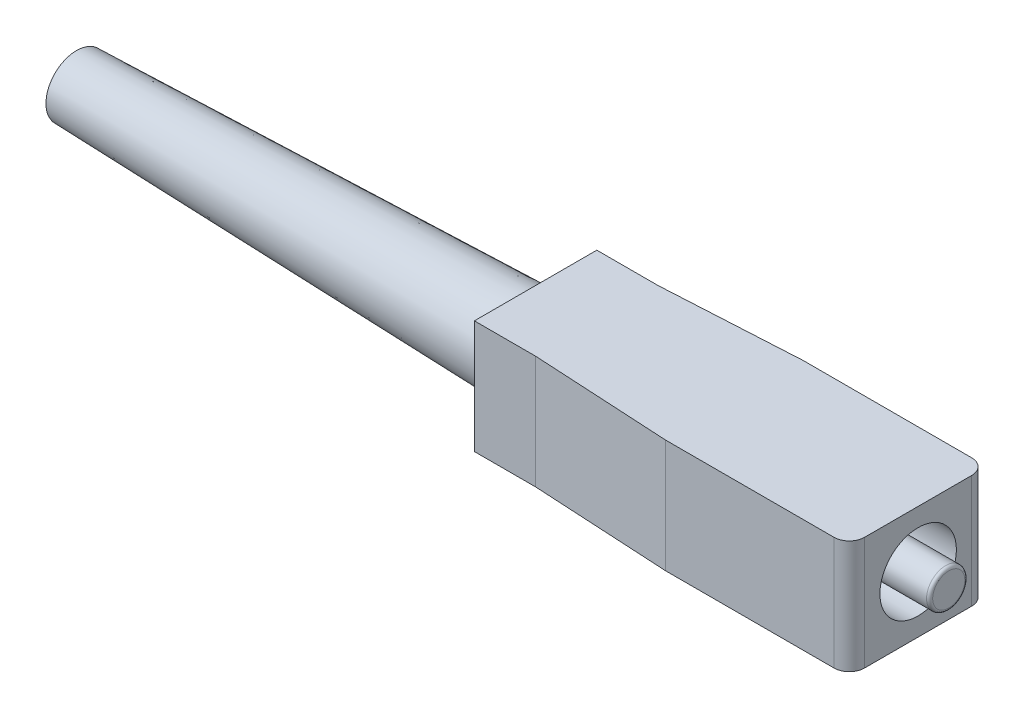
ISO-10303-21;
HEADER;
FILE_DESCRIPTION(('STEP AP214'),'2;1');
FILE_NAME('part.step','',(''),(''),'','','');
FILE_SCHEMA(('AUTOMOTIVE_DESIGN { 1 0 10303 214 1 1 1 1 }'));
ENDSEC;
DATA;
#1=APPLICATION_CONTEXT('core data for automotive mechanical design processes');
#2=APPLICATION_PROTOCOL_DEFINITION('international standard','automotive_design',2000,#1);
#3=PRODUCT_CONTEXT('',#1,'mechanical');
#4=PRODUCT('Part','Part','',(#3));
#5=PRODUCT_RELATED_PRODUCT_CATEGORY('part','',(#4));
#6=PRODUCT_DEFINITION_FORMATION('','',#4);
#7=PRODUCT_DEFINITION_CONTEXT('part definition',#1,'design');
#8=PRODUCT_DEFINITION('design','',#6,#7);
#9=PRODUCT_DEFINITION_SHAPE('','',#8);
#10=(LENGTH_UNIT() NAMED_UNIT(*) SI_UNIT(.MILLI.,.METRE.));
#11=(NAMED_UNIT(*) PLANE_ANGLE_UNIT() SI_UNIT($,.RADIAN.));
#12=(NAMED_UNIT(*) SI_UNIT($,.STERADIAN.) SOLID_ANGLE_UNIT());
#13=UNCERTAINTY_MEASURE_WITH_UNIT(LENGTH_MEASURE(1.E-05),#10,'distance_accuracy_value','');
#14=(GEOMETRIC_REPRESENTATION_CONTEXT(3) GLOBAL_UNCERTAINTY_ASSIGNED_CONTEXT((#13)) GLOBAL_UNIT_ASSIGNED_CONTEXT((#10,
#11,#12)) REPRESENTATION_CONTEXT('',''));
#15=CARTESIAN_POINT('',(0.,0.,0.));
#16=DIRECTION('',(0.,0.,1.));
#17=DIRECTION('',(1.,0.,0.));
#18=AXIS2_PLACEMENT_3D('',#15,#16,#17);
#19=CARTESIAN_POINT('',(7.,0.,0.));
#20=DIRECTION('',(1.,0.,0.));
#21=DIRECTION('',(0.,0.,-1.));
#22=AXIS2_PLACEMENT_3D('',#19,#20,#21);
#23=PLANE('',#22);
#24=CARTESIAN_POINT('',(7.,0.,0.));
#25=DIRECTION('',(1.,0.,0.));
#26=DIRECTION('',(0.,0.,-1.));
#27=AXIS2_PLACEMENT_3D('',#24,#25,#26);
#28=CIRCLE('',#27,2.5);
#29=CARTESIAN_POINT('',(7.,0.,-2.5));
#30=VERTEX_POINT('',#29);
#31=EDGE_CURVE('E145',#30,#30,#28,.T.);
#32=ORIENTED_EDGE('',*,*,#31,.T.);
#33=EDGE_LOOP('',(#32));
#34=FACE_BOUND('',#33,.T.);
#35=CARTESIAN_POINT('',(7.,0.,0.));
#36=DIRECTION('',(1.,0.,0.));
#37=DIRECTION('',(0.,0.,-1.));
#38=AXIS2_PLACEMENT_3D('',#35,#36,#37);
#39=CIRCLE('',#38,1.25);
#40=CARTESIAN_POINT('',(7.,0.,1.25));
#41=VERTEX_POINT('',#40);
#42=EDGE_CURVE('E412',#41,#41,#39,.T.);
#43=ORIENTED_EDGE('',*,*,#42,.F.);
#44=EDGE_LOOP('',(#43));
#45=FACE_BOUND('',#44,.T.);
#46=ADVANCED_FACE('F39',(#34,#45),#23,.T.);
#47=CARTESIAN_POINT('',(-9.,-3.7,-4.));
#48=DIRECTION('',(0.,0.,-1.));
#49=DIRECTION('',(-1.,0.,0.));
#50=AXIS2_PLACEMENT_3D('',#47,#48,#49);
#51=PLANE('',#50);
#52=DIRECTION('',(0.,1.,0.));
#53=VECTOR('',#52,1.);
#54=CARTESIAN_POINT('',(-13.,-3.7,-4.));
#55=LINE('',#54,#53);
#56=CARTESIAN_POINT('',(-13.,-3.7,-4.));
#57=VERTEX_POINT('',#56);
#58=CARTESIAN_POINT('',(-13.,3.7,-4.));
#59=VERTEX_POINT('',#58);
#60=EDGE_CURVE('E119',#57,#59,#55,.T.);
#61=ORIENTED_EDGE('',*,*,#60,.T.);
#62=DIRECTION('',(-1.,0.,0.));
#63=VECTOR('',#62,1.);
#64=CARTESIAN_POINT('',(-9.,3.7,-4.));
#65=LINE('',#64,#63);
#66=CARTESIAN_POINT('',(-9.,3.7,-4.));
#67=VERTEX_POINT('',#66);
#68=EDGE_CURVE('E123',#67,#59,#65,.T.);
#69=ORIENTED_EDGE('',*,*,#68,.F.);
#70=DIRECTION('',(0.,1.,0.));
#71=VECTOR('',#70,1.);
#72=CARTESIAN_POINT('',(-9.,-3.7,-4.));
#73=LINE('',#72,#71);
#74=CARTESIAN_POINT('',(-9.,-3.7,-4.));
#75=VERTEX_POINT('',#74);
#76=EDGE_CURVE('E182',#75,#67,#73,.T.);
#77=ORIENTED_EDGE('',*,*,#76,.F.);
#78=DIRECTION('',(-1.,0.,0.));
#79=VECTOR('',#78,1.);
#80=CARTESIAN_POINT('',(-9.,-3.7,-4.));
#81=LINE('',#80,#79);
#82=EDGE_CURVE('E125',#75,#57,#81,.T.);
#83=ORIENTED_EDGE('',*,*,#82,.T.);
#84=EDGE_LOOP('',(#61,#69,#77,#83));
#85=FACE_BOUND('',#84,.T.);
#86=ADVANCED_FACE('F121',(#85),#51,.T.);
#87=CARTESIAN_POINT('',(0.,-3.7,-4.5));
#88=DIRECTION('',(-0.055470019622523,0.,-0.998460353205412));
#89=DIRECTION('',(-0.998460353205412,0.,0.0554700196225231));
#90=AXIS2_PLACEMENT_3D('',#87,#88,#89);
#91=PLANE('',#90);
#92=ORIENTED_EDGE('',*,*,#76,.T.);
#93=DIRECTION('',(-0.998460353205412,0.,0.0554700196225231));
#94=VECTOR('',#93,1.);
#95=CARTESIAN_POINT('',(0.,3.7,-4.5));
#96=LINE('',#95,#94);
#97=CARTESIAN_POINT('',(0.,3.7,-4.5));
#98=VERTEX_POINT('',#97);
#99=EDGE_CURVE('E144',#98,#67,#96,.T.);
#100=ORIENTED_EDGE('',*,*,#99,.F.);
#101=DIRECTION('',(0.,1.,0.));
#102=VECTOR('',#101,1.);
#103=CARTESIAN_POINT('',(0.,-3.7,-4.5));
#104=LINE('',#103,#102);
#105=CARTESIAN_POINT('',(0.,-3.7,-4.5));
#106=VERTEX_POINT('',#105);
#107=EDGE_CURVE('E185',#106,#98,#104,.T.);
#108=ORIENTED_EDGE('',*,*,#107,.F.);
#109=DIRECTION('',(-0.998460353205412,0.,0.0554700196225231));
#110=VECTOR('',#109,1.);
#111=CARTESIAN_POINT('',(0.,-3.7,-4.5));
#112=LINE('',#111,#110);
#113=EDGE_CURVE('E130',#106,#75,#112,.T.);
#114=ORIENTED_EDGE('',*,*,#113,.T.);
#115=EDGE_LOOP('',(#92,#100,#108,#114));
#116=FACE_BOUND('',#115,.T.);
#117=ADVANCED_FACE('F243',(#116),#91,.T.);
#118=CARTESIAN_POINT('',(12.,-3.7,-4.5));
#119=DIRECTION('',(0.,0.,-1.));
#120=DIRECTION('',(-1.,0.,0.));
#121=AXIS2_PLACEMENT_3D('',#118,#119,#120);
#122=PLANE('',#121);
#123=DIRECTION('',(-1.,0.,0.));
#124=VECTOR('',#123,1.);
#125=CARTESIAN_POINT('',(12.,3.7,-4.5));
#126=LINE('',#125,#124);
#127=CARTESIAN_POINT('',(11.,3.7,-4.5));
#128=VERTEX_POINT('',#127);
#129=EDGE_CURVE('E161',#128,#98,#126,.T.);
#130=ORIENTED_EDGE('',*,*,#129,.F.);
#131=DIRECTION('',(0.,1.,0.));
#132=VECTOR('',#131,1.);
#133=CARTESIAN_POINT('',(11.,-3.7,-4.5));
#134=LINE('',#133,#132);
#135=CARTESIAN_POINT('',(11.,-3.7,-4.5));
#136=VERTEX_POINT('',#135);
#137=EDGE_CURVE('E62',#128,#136,#134,.F.);
#138=ORIENTED_EDGE('',*,*,#137,.T.);
#139=DIRECTION('',(-1.,0.,0.));
#140=VECTOR('',#139,1.);
#141=CARTESIAN_POINT('',(12.,-3.7,-4.5));
#142=LINE('',#141,#140);
#143=EDGE_CURVE('E178',#136,#106,#142,.T.);
#144=ORIENTED_EDGE('',*,*,#143,.T.);
#145=ORIENTED_EDGE('',*,*,#107,.T.);
#146=EDGE_LOOP('',(#130,#138,#144,#145));
#147=FACE_BOUND('',#146,.T.);
#148=ADVANCED_FACE('F256',(#147),#122,.T.);
#149=CARTESIAN_POINT('',(12.,-3.7,-4.5));
#150=DIRECTION('',(1.,0.,0.));
#151=DIRECTION('',(0.,0.,-1.));
#152=AXIS2_PLACEMENT_3D('',#149,#150,#151);
#153=PLANE('',#152);
#154=CARTESIAN_POINT('',(12.,0.,0.));
#155=DIRECTION('',(1.,0.,0.));
#156=DIRECTION('',(0.,0.,-1.));
#157=AXIS2_PLACEMENT_3D('',#154,#155,#156);
#158=CIRCLE('',#157,2.5);
#159=CARTESIAN_POINT('',(12.,0.,-2.5));
#160=VERTEX_POINT('',#159);
#161=EDGE_CURVE('E148',#160,#160,#158,.T.);
#162=ORIENTED_EDGE('',*,*,#161,.F.);
#163=EDGE_LOOP('',(#162));
#164=FACE_BOUND('',#163,.T.);
#165=DIRECTION('',(0.,0.,-1.));
#166=VECTOR('',#165,1.);
#167=CARTESIAN_POINT('',(12.,-3.7,-4.5));
#168=LINE('',#167,#166);
#169=CARTESIAN_POINT('',(12.,-3.7,3.5));
#170=VERTEX_POINT('',#169);
#171=CARTESIAN_POINT('',(12.,-3.7,-3.5));
#172=VERTEX_POINT('',#171);
#173=EDGE_CURVE('E175',#170,#172,#168,.T.);
#174=ORIENTED_EDGE('',*,*,#173,.T.);
#175=DIRECTION('',(0.,1.,0.));
#176=VECTOR('',#175,1.);
#177=CARTESIAN_POINT('',(12.,-3.7,-3.5));
#178=LINE('',#177,#176);
#179=CARTESIAN_POINT('',(12.,3.7,-3.5));
#180=VERTEX_POINT('',#179);
#181=EDGE_CURVE('E194',#172,#180,#178,.T.);
#182=ORIENTED_EDGE('',*,*,#181,.T.);
#183=DIRECTION('',(0.,0.,-1.));
#184=VECTOR('',#183,1.);
#185=CARTESIAN_POINT('',(12.,3.7,-4.5));
#186=LINE('',#185,#184);
#187=CARTESIAN_POINT('',(12.,3.7,3.5));
#188=VERTEX_POINT('',#187);
#189=EDGE_CURVE('E159',#188,#180,#186,.T.);
#190=ORIENTED_EDGE('',*,*,#189,.F.);
#191=DIRECTION('',(0.,1.,0.));
#192=VECTOR('',#191,1.);
#193=CARTESIAN_POINT('',(12.,-3.7,3.5));
#194=LINE('',#193,#192);
#195=EDGE_CURVE('E184',#188,#170,#194,.F.);
#196=ORIENTED_EDGE('',*,*,#195,.T.);
#197=EDGE_LOOP('',(#174,#182,#190,#196));
#198=FACE_BOUND('',#197,.T.);
#199=ADVANCED_FACE('F260',(#164,#198),#153,.T.);
#200=CARTESIAN_POINT('',(12.,-3.7,4.5));
#201=DIRECTION('',(0.,0.,1.));
#202=DIRECTION('',(1.,0.,0.));
#203=AXIS2_PLACEMENT_3D('',#200,#201,#202);
#204=PLANE('',#203);
#205=DIRECTION('',(1.,0.,0.));
#206=VECTOR('',#205,1.);
#207=CARTESIAN_POINT('',(12.,-3.7,4.5));
#208=LINE('',#207,#206);
#209=CARTESIAN_POINT('',(0.,-3.7,4.5));
#210=VERTEX_POINT('',#209);
#211=CARTESIAN_POINT('',(11.,-3.7,4.5));
#212=VERTEX_POINT('',#211);
#213=EDGE_CURVE('E173',#210,#212,#208,.T.);
#214=ORIENTED_EDGE('',*,*,#213,.T.);
#215=DIRECTION('',(0.,1.,0.));
#216=VECTOR('',#215,1.);
#217=CARTESIAN_POINT('',(11.,-3.7,4.5));
#218=LINE('',#217,#216);
#219=CARTESIAN_POINT('',(11.,3.7,4.5));
#220=VERTEX_POINT('',#219);
#221=EDGE_CURVE('E205',#212,#220,#218,.T.);
#222=ORIENTED_EDGE('',*,*,#221,.T.);
#223=DIRECTION('',(1.,0.,0.));
#224=VECTOR('',#223,1.);
#225=CARTESIAN_POINT('',(12.,3.7,4.5));
#226=LINE('',#225,#224);
#227=CARTESIAN_POINT('',(0.,3.7,4.5));
#228=VERTEX_POINT('',#227);
#229=EDGE_CURVE('E156',#228,#220,#226,.T.);
#230=ORIENTED_EDGE('',*,*,#229,.F.);
#231=DIRECTION('',(0.,1.,0.));
#232=VECTOR('',#231,1.);
#233=CARTESIAN_POINT('',(0.,-3.7,4.5));
#234=LINE('',#233,#232);
#235=EDGE_CURVE('E188',#210,#228,#234,.T.);
#236=ORIENTED_EDGE('',*,*,#235,.F.);
#237=EDGE_LOOP('',(#214,#222,#230,#236));
#238=FACE_BOUND('',#237,.T.);
#239=ADVANCED_FACE('F263',(#238),#204,.T.);
#240=CARTESIAN_POINT('',(0.,-3.7,4.5));
#241=DIRECTION('',(-0.055470019622523,0.,0.998460353205412));
#242=DIRECTION('',(0.998460353205412,0.,0.0554700196225231));
#243=AXIS2_PLACEMENT_3D('',#240,#241,#242);
#244=PLANE('',#243);
#245=ORIENTED_EDGE('',*,*,#235,.T.);
#246=DIRECTION('',(0.998460353205412,0.,0.0554700196225231));
#247=VECTOR('',#246,1.);
#248=CARTESIAN_POINT('',(0.,3.7,4.5));
#249=LINE('',#248,#247);
#250=CARTESIAN_POINT('',(-9.,3.7,4.));
#251=VERTEX_POINT('',#250);
#252=EDGE_CURVE('E153',#251,#228,#249,.T.);
#253=ORIENTED_EDGE('',*,*,#252,.F.);
#254=DIRECTION('',(0.,1.,0.));
#255=VECTOR('',#254,1.);
#256=CARTESIAN_POINT('',(-9.,-3.7,4.));
#257=LINE('',#256,#255);
#258=CARTESIAN_POINT('',(-9.,-3.7,4.));
#259=VERTEX_POINT('',#258);
#260=EDGE_CURVE('E190',#259,#251,#257,.T.);
#261=ORIENTED_EDGE('',*,*,#260,.F.);
#262=DIRECTION('',(0.998460353205412,0.,0.0554700196225231));
#263=VECTOR('',#262,1.);
#264=CARTESIAN_POINT('',(0.,-3.7,4.5));
#265=LINE('',#264,#263);
#266=EDGE_CURVE('E170',#259,#210,#265,.T.);
#267=ORIENTED_EDGE('',*,*,#266,.T.);
#268=EDGE_LOOP('',(#245,#253,#261,#267));
#269=FACE_BOUND('',#268,.T.);
#270=ADVANCED_FACE('F267',(#269),#244,.T.);
#271=CARTESIAN_POINT('',(-9.,-3.7,4.));
#272=DIRECTION('',(0.,0.,1.));
#273=DIRECTION('',(1.,0.,0.));
#274=AXIS2_PLACEMENT_3D('',#271,#272,#273);
#275=PLANE('',#274);
#276=ORIENTED_EDGE('',*,*,#260,.T.);
#277=DIRECTION('',(1.,0.,0.));
#278=VECTOR('',#277,1.);
#279=CARTESIAN_POINT('',(-9.,3.7,4.));
#280=LINE('',#279,#278);
#281=CARTESIAN_POINT('',(-13.,3.7,4.));
#282=VERTEX_POINT('',#281);
#283=EDGE_CURVE('E138',#282,#251,#280,.T.);
#284=ORIENTED_EDGE('',*,*,#283,.F.);
#285=DIRECTION('',(0.,1.,0.));
#286=VECTOR('',#285,1.);
#287=CARTESIAN_POINT('',(-13.,-3.7,4.));
#288=LINE('',#287,#286);
#289=CARTESIAN_POINT('',(-13.,-3.7,4.));
#290=VERTEX_POINT('',#289);
#291=EDGE_CURVE('E129',#290,#282,#288,.T.);
#292=ORIENTED_EDGE('',*,*,#291,.F.);
#293=DIRECTION('',(1.,0.,0.));
#294=VECTOR('',#293,1.);
#295=CARTESIAN_POINT('',(-9.,-3.7,4.));
#296=LINE('',#295,#294);
#297=EDGE_CURVE('E167',#290,#259,#296,.T.);
#298=ORIENTED_EDGE('',*,*,#297,.T.);
#299=EDGE_LOOP('',(#276,#284,#292,#298));
#300=FACE_BOUND('',#299,.T.);
#301=ADVANCED_FACE('F271',(#300),#275,.T.);
#302=CARTESIAN_POINT('',(-13.,-3.7,4.));
#303=DIRECTION('',(-1.,0.,0.));
#304=DIRECTION('',(0.,0.,1.));
#305=AXIS2_PLACEMENT_3D('',#302,#303,#304);
#306=PLANE('',#305);
#307=CARTESIAN_POINT('',(-13.,0.,0.));
#308=DIRECTION('',(-1.,0.,0.));
#309=DIRECTION('',(0.,0.,1.));
#310=AXIS2_PLACEMENT_3D('',#307,#308,#309);
#311=CIRCLE('',#310,2.9);
#312=CARTESIAN_POINT('',(-13.,0.,2.9));
#313=VERTEX_POINT('',#312);
#314=EDGE_CURVE('E12',#313,#313,#311,.T.);
#315=ORIENTED_EDGE('',*,*,#314,.F.);
#316=EDGE_LOOP('',(#315));
#317=FACE_BOUND('',#316,.T.);
#318=ORIENTED_EDGE('',*,*,#291,.T.);
#319=DIRECTION('',(0.,0.,1.));
#320=VECTOR('',#319,1.);
#321=CARTESIAN_POINT('',(-13.,3.7,4.));
#322=LINE('',#321,#320);
#323=EDGE_CURVE('E133',#59,#282,#322,.T.);
#324=ORIENTED_EDGE('',*,*,#323,.F.);
#325=ORIENTED_EDGE('',*,*,#60,.F.);
#326=DIRECTION('',(0.,0.,1.));
#327=VECTOR('',#326,1.);
#328=CARTESIAN_POINT('',(-13.,-3.7,4.));
#329=LINE('',#328,#327);
#330=EDGE_CURVE('E165',#57,#290,#329,.T.);
#331=ORIENTED_EDGE('',*,*,#330,.T.);
#332=EDGE_LOOP('',(#318,#324,#325,#331));
#333=FACE_BOUND('',#332,.T.);
#334=ADVANCED_FACE('F134',(#317,#333),#306,.T.);
#335=CARTESIAN_POINT('',(0.,-3.7,0.));
#336=DIRECTION('',(0.,-1.,0.));
#337=DIRECTION('',(0.,0.,-1.));
#338=AXIS2_PLACEMENT_3D('',#335,#336,#337);
#339=PLANE('',#338);
#340=ORIENTED_EDGE('',*,*,#143,.F.);
#341=CARTESIAN_POINT('',(11.,-3.7,-3.5));
#342=DIRECTION('',(0.,-1.,0.));
#343=DIRECTION('',(0.,0.,-1.));
#344=AXIS2_PLACEMENT_3D('',#341,#342,#343);
#345=CIRCLE('',#344,1.);
#346=EDGE_CURVE('E203',#136,#172,#345,.T.);
#347=ORIENTED_EDGE('',*,*,#346,.T.);
#348=ORIENTED_EDGE('',*,*,#173,.F.);
#349=CARTESIAN_POINT('',(11.,-3.7,3.5));
#350=DIRECTION('',(0.,-1.,0.));
#351=DIRECTION('',(0.,0.,-1.));
#352=AXIS2_PLACEMENT_3D('',#349,#350,#351);
#353=CIRCLE('',#352,1.);
#354=EDGE_CURVE('E54',#170,#212,#353,.T.);
#355=ORIENTED_EDGE('',*,*,#354,.T.);
#356=ORIENTED_EDGE('',*,*,#213,.F.);
#357=ORIENTED_EDGE('',*,*,#266,.F.);
#358=ORIENTED_EDGE('',*,*,#297,.F.);
#359=ORIENTED_EDGE('',*,*,#330,.F.);
#360=ORIENTED_EDGE('',*,*,#82,.F.);
#361=ORIENTED_EDGE('',*,*,#113,.F.);
#362=EDGE_LOOP('',(#340,#347,#348,#355,#356,#357,#358,#359,#360,#361));
#363=FACE_BOUND('',#362,.T.);
#364=ADVANCED_FACE('F251',(#363),#339,.T.);
#365=CARTESIAN_POINT('',(0.,3.7,0.));
#366=DIRECTION('',(0.,-1.,0.));
#367=DIRECTION('',(0.,0.,-1.));
#368=AXIS2_PLACEMENT_3D('',#365,#366,#367);
#369=PLANE('',#368);
#370=ORIENTED_EDGE('',*,*,#189,.T.);
#371=CARTESIAN_POINT('',(11.,3.7,-3.5));
#372=DIRECTION('',(0.,-1.,0.));
#373=DIRECTION('',(0.,0.,-1.));
#374=AXIS2_PLACEMENT_3D('',#371,#372,#373);
#375=CIRCLE('',#374,1.);
#376=EDGE_CURVE('E199',#180,#128,#375,.F.);
#377=ORIENTED_EDGE('',*,*,#376,.T.);
#378=ORIENTED_EDGE('',*,*,#129,.T.);
#379=ORIENTED_EDGE('',*,*,#99,.T.);
#380=ORIENTED_EDGE('',*,*,#68,.T.);
#381=ORIENTED_EDGE('',*,*,#323,.T.);
#382=ORIENTED_EDGE('',*,*,#283,.T.);
#383=ORIENTED_EDGE('',*,*,#252,.T.);
#384=ORIENTED_EDGE('',*,*,#229,.T.);
#385=CARTESIAN_POINT('',(11.,3.7,3.5));
#386=DIRECTION('',(0.,-1.,0.));
#387=DIRECTION('',(0.,0.,-1.));
#388=AXIS2_PLACEMENT_3D('',#385,#386,#387);
#389=CIRCLE('',#388,1.);
#390=EDGE_CURVE('E197',#220,#188,#389,.F.);
#391=ORIENTED_EDGE('',*,*,#390,.T.);
#392=EDGE_LOOP('',(#370,#377,#378,#379,#380,#381,#382,#383,#384,#391));
#393=FACE_BOUND('',#392,.T.);
#394=ADVANCED_FACE('F142',(#393),#369,.F.);
#395=CARTESIAN_POINT('',(7.,0.,0.));
#396=DIRECTION('',(1.,0.,0.));
#397=DIRECTION('',(0.,0.,-1.));
#398=AXIS2_PLACEMENT_3D('',#395,#396,#397);
#399=CYLINDRICAL_SURFACE('',#398,2.5);
#400=ORIENTED_EDGE('',*,*,#31,.F.);
#401=EDGE_LOOP('',(#400));
#402=FACE_BOUND('',#401,.T.);
#403=ORIENTED_EDGE('',*,*,#161,.T.);
#404=EDGE_LOOP('',(#403));
#405=FACE_BOUND('',#404,.T.);
#406=ADVANCED_FACE('F233',(#402,#405),#399,.F.);
#407=CARTESIAN_POINT('',(19.5355339059327,0.,0.));
#408=DIRECTION('',(-1.,0.,0.));
#409=DIRECTION('',(0.,0.,1.));
#410=AXIS2_PLACEMENT_3D('',#407,#408,#409);
#411=CYLINDRICAL_SURFACE('',#410,1.25);
#412=CARTESIAN_POINT('',(13.8,0.,0.));
#413=DIRECTION('',(1.,0.,0.));
#414=DIRECTION('',(0.,0.,-1.));
#415=AXIS2_PLACEMENT_3D('',#412,#413,#414);
#416=CIRCLE('',#415,1.25);
#417=CARTESIAN_POINT('',(13.8,0.,1.25));
#418=VERTEX_POINT('',#417);
#419=EDGE_CURVE('E47',#418,#418,#416,.F.);
#420=CARTESIAN_POINT('',(13.8,0.,1.25));
#421=CARTESIAN_POINT('',(13.7291666666667,0.,1.25));
#422=CARTESIAN_POINT('',(13.6583333333333,0.,1.25));
#423=CARTESIAN_POINT('',(13.5166666666667,0.,1.25));
#424=CARTESIAN_POINT('',(13.4458333333333,0.,1.25));
#425=CARTESIAN_POINT('',(13.3041666666667,0.,1.25));
#426=CARTESIAN_POINT('',(13.2333333333333,0.,1.25));
#427=CARTESIAN_POINT('',(13.0916666666667,0.,1.25));
#428=CARTESIAN_POINT('',(13.0208333333333,0.,1.25));
#429=CARTESIAN_POINT('',(12.8791666666667,0.,1.25));
#430=CARTESIAN_POINT('',(12.8083333333333,0.,1.25));
#431=CARTESIAN_POINT('',(12.6666666666667,0.,1.25));
#432=CARTESIAN_POINT('',(12.5958333333333,0.,1.25));
#433=CARTESIAN_POINT('',(12.4541666666667,0.,1.25));
#434=CARTESIAN_POINT('',(12.3833333333333,0.,1.25));
#435=CARTESIAN_POINT('',(12.2416666666667,0.,1.25));
#436=CARTESIAN_POINT('',(12.1708333333333,0.,1.25));
#437=CARTESIAN_POINT('',(12.0291666666667,0.,1.25));
#438=CARTESIAN_POINT('',(11.9583333333333,0.,1.25));
#439=CARTESIAN_POINT('',(11.8166666666667,0.,1.25));
#440=CARTESIAN_POINT('',(11.7458333333333,0.,1.25));
#441=CARTESIAN_POINT('',(11.6041666666667,0.,1.25));
#442=CARTESIAN_POINT('',(11.5333333333333,0.,1.25));
#443=CARTESIAN_POINT('',(11.3916666666667,0.,1.25));
#444=CARTESIAN_POINT('',(11.3208333333333,0.,1.25));
#445=CARTESIAN_POINT('',(11.1791666666667,0.,1.25));
#446=CARTESIAN_POINT('',(11.1083333333333,0.,1.25));
#447=CARTESIAN_POINT('',(10.9666666666667,0.,1.25));
#448=CARTESIAN_POINT('',(10.8958333333333,0.,1.25));
#449=CARTESIAN_POINT('',(10.7541666666667,0.,1.25));
#450=CARTESIAN_POINT('',(10.6833333333333,0.,1.25));
#451=CARTESIAN_POINT('',(10.5416666666667,0.,1.25));
#452=CARTESIAN_POINT('',(10.4708333333333,0.,1.25));
#453=CARTESIAN_POINT('',(10.3291666666667,0.,1.25));
#454=CARTESIAN_POINT('',(10.2583333333333,0.,1.25));
#455=CARTESIAN_POINT('',(10.1166666666667,0.,1.25));
#456=CARTESIAN_POINT('',(10.0458333333333,0.,1.25));
#457=CARTESIAN_POINT('',(9.90416666666667,0.,1.25));
#458=CARTESIAN_POINT('',(9.83333333333333,0.,1.25));
#459=CARTESIAN_POINT('',(9.69166666666667,0.,1.25));
#460=CARTESIAN_POINT('',(9.62083333333333,0.,1.25));
#461=CARTESIAN_POINT('',(9.47916666666667,0.,1.25));
#462=CARTESIAN_POINT('',(9.40833333333333,0.,1.25));
#463=CARTESIAN_POINT('',(9.26666666666667,0.,1.25));
#464=CARTESIAN_POINT('',(9.19583333333333,0.,1.25));
#465=CARTESIAN_POINT('',(9.05416666666667,0.,1.25));
#466=CARTESIAN_POINT('',(8.98333333333333,0.,1.25));
#467=CARTESIAN_POINT('',(8.84166666666667,0.,1.25));
#468=CARTESIAN_POINT('',(8.77083333333333,0.,1.25));
#469=CARTESIAN_POINT('',(8.62916666666667,0.,1.25));
#470=CARTESIAN_POINT('',(8.55833333333333,0.,1.25));
#471=CARTESIAN_POINT('',(8.41666666666667,0.,1.25));
#472=CARTESIAN_POINT('',(8.34583333333333,0.,1.25));
#473=CARTESIAN_POINT('',(8.20416666666667,0.,1.25));
#474=CARTESIAN_POINT('',(8.13333333333333,0.,1.25));
#475=CARTESIAN_POINT('',(7.99166666666667,0.,1.25));
#476=CARTESIAN_POINT('',(7.92083333333334,0.,1.25));
#477=CARTESIAN_POINT('',(7.77916666666667,0.,1.25));
#478=CARTESIAN_POINT('',(7.70833333333333,0.,1.25));
#479=CARTESIAN_POINT('',(7.56666666666667,0.,1.25));
#480=CARTESIAN_POINT('',(7.49583333333333,0.,1.25));
#481=CARTESIAN_POINT('',(7.35416666666667,0.,1.25));
#482=CARTESIAN_POINT('',(7.28333333333333,0.,1.25));
#483=CARTESIAN_POINT('',(7.14166666666667,0.,1.25));
#484=CARTESIAN_POINT('',(7.07083333333333,0.,1.25));
#485=CARTESIAN_POINT('',(7.,0.,1.25));
#486=B_SPLINE_CURVE_WITH_KNOTS('',3,(#420,#421,#422,#423,#424,#425,#426,#427,#428,#429,#430,
#431,#432,#433,#434,#435,#436,#437,#438,#439,#440,#441,#442,#443,#444,#445,#446,#447,#448,#449,
#450,#451,#452,#453,#454,#455,#456,#457,#458,#459,#460,#461,#462,#463,#464,#465,#466,#467,#468,
#469,#470,#471,#472,#473,#474,#475,#476,#477,#478,#479,#480,#481,#482,#483,#484,#485),
.UNSPECIFIED.,.F.,.F.,(4,2,2,2,2,2,2,2,2,2,2,2,2,2,2,2,2,2,2,2,2,2,2,2,2,2,2,2,2,2,2,2,4),(0.,
0.212500000000001,0.425000000000002,0.637500000000001,0.85,1.0625,1.275,1.4875,1.7,1.9125,2.125,
2.3375,2.55,2.7625,2.975,3.1875,3.4,3.6125,3.825,4.0375,4.25,4.4625,4.675,4.8875,5.1,5.3125,
5.525,5.7375,5.95,6.1625,6.375,6.5875,6.8),.UNSPECIFIED.);
#487=EDGE_CURVE('BSEAM213',#418,#41,#486,.T.);
#488=ORIENTED_EDGE('',*,*,#419,.T.);
#489=ORIENTED_EDGE('',*,*,#42,.T.);
#490=ORIENTED_EDGE('',*,*,#487,.T.);
#491=ORIENTED_EDGE('',*,*,#487,.F.);
#492=EDGE_LOOP('',(#488,#490,#489,#491));
#493=FACE_BOUND('',#492,.T.);
#494=ADVANCED_FACE('F213',(#493),#411,.T.);
#495=CARTESIAN_POINT('',(14.,-3.7,-4.5));
#496=DIRECTION('',(1.,0.,0.));
#497=DIRECTION('',(0.,0.,-1.));
#498=AXIS2_PLACEMENT_3D('',#495,#496,#497);
#499=PLANE('',#498);
#500=CARTESIAN_POINT('',(14.,0.,0.));
#501=DIRECTION('',(1.,0.,0.));
#502=DIRECTION('',(0.,0.,-1.));
#503=AXIS2_PLACEMENT_3D('',#500,#501,#502);
#504=CIRCLE('',#503,1.05);
#505=CARTESIAN_POINT('',(14.,0.,-1.05));
#506=VERTEX_POINT('',#505);
#507=EDGE_CURVE('E208',#506,#506,#504,.T.);
#508=ORIENTED_EDGE('',*,*,#507,.T.);
#509=EDGE_LOOP('',(#508));
#510=FACE_BOUND('',#509,.T.);
#511=ADVANCED_FACE('F222',(#510),#499,.T.);
#512=CARTESIAN_POINT('',(11.,-3.7,-3.5));
#513=DIRECTION('',(0.,1.,0.));
#514=DIRECTION('',(0.,0.,1.));
#515=AXIS2_PLACEMENT_3D('',#512,#513,#514);
#516=CYLINDRICAL_SURFACE('',#515,1.);
#517=ORIENTED_EDGE('',*,*,#346,.F.);
#518=ORIENTED_EDGE('',*,*,#137,.F.);
#519=ORIENTED_EDGE('',*,*,#376,.F.);
#520=ORIENTED_EDGE('',*,*,#181,.F.);
#521=EDGE_LOOP('',(#517,#518,#519,#520));
#522=FACE_BOUND('',#521,.T.);
#523=ADVANCED_FACE('F224',(#522),#516,.T.);
#524=CARTESIAN_POINT('',(11.,-3.7,3.5));
#525=DIRECTION('',(0.,1.,0.));
#526=DIRECTION('',(0.,0.,1.));
#527=AXIS2_PLACEMENT_3D('',#524,#525,#526);
#528=CYLINDRICAL_SURFACE('',#527,1.);
#529=ORIENTED_EDGE('',*,*,#354,.F.);
#530=ORIENTED_EDGE('',*,*,#195,.F.);
#531=ORIENTED_EDGE('',*,*,#390,.F.);
#532=ORIENTED_EDGE('',*,*,#221,.F.);
#533=EDGE_LOOP('',(#529,#530,#531,#532));
#534=FACE_BOUND('',#533,.T.);
#535=ADVANCED_FACE('F219',(#534),#528,.T.);
#536=CARTESIAN_POINT('',(13.8,0.,0.));
#537=DIRECTION('',(1.,0.,0.));
#538=DIRECTION('',(0.,0.,-1.));
#539=AXIS2_PLACEMENT_3D('',#536,#537,#538);
#540=TOROIDAL_SURFACE('',#539,1.05,0.2);
#541=ORIENTED_EDGE('',*,*,#419,.F.);
#542=EDGE_LOOP('',(#541));
#543=FACE_BOUND('',#542,.T.);
#544=ORIENTED_EDGE('',*,*,#507,.F.);
#545=EDGE_LOOP('',(#544));
#546=FACE_BOUND('',#545,.T.);
#547=ADVANCED_FACE('F41',(#543,#546),#540,.T.);
#548=CARTESIAN_POINT('',(-43.,0.,-1.99999999999999));
#549=DIRECTION('',(-1.,0.,0.));
#550=DIRECTION('',(0.,0.,1.));
#551=AXIS2_PLACEMENT_3D('',#548,#549,#550);
#552=PLANE('',#551);
#553=CARTESIAN_POINT('',(-43.,0.,0.));
#554=DIRECTION('',(1.,0.,0.));
#555=DIRECTION('',(0.,0.,-1.));
#556=AXIS2_PLACEMENT_3D('',#553,#554,#555);
#557=CIRCLE('',#556,1.99999999999999);
#558=CARTESIAN_POINT('',(-43.,0.,-1.99999999999999));
#559=VERTEX_POINT('',#558);
#560=EDGE_CURVE('E410',#559,#559,#557,.T.);
#561=ORIENTED_EDGE('',*,*,#560,.F.);
#562=EDGE_LOOP('',(#561));
#563=FACE_BOUND('',#562,.T.);
#564=ADVANCED_FACE('F218',(#563),#552,.T.);
#565=CARTESIAN_POINT('',(-13.,0.,0.));
#566=DIRECTION('',(1.,0.,0.));
#567=DIRECTION('',(0.,0.,-1.));
#568=AXIS2_PLACEMENT_3D('',#565,#566,#567);
#569=CONICAL_SURFACE('',#568,2.9,0.029991004856878);
#570=ORIENTED_EDGE('',*,*,#560,.T.);
#571=EDGE_LOOP('',(#570));
#572=FACE_BOUND('',#571,.T.);
#573=ORIENTED_EDGE('',*,*,#314,.T.);
#574=EDGE_LOOP('',(#573));
#575=FACE_BOUND('',#574,.T.);
#576=ADVANCED_FACE('F305',(#572,#575),#569,.T.);
#577=CLOSED_SHELL('',(#46,#86,#117,#148,#199,#239,#270,#301,#334,#364,#394,#406,#494,#511,#523,
#535,#547,#564,#576));
#578=MANIFOLD_SOLID_BREP('B2',#577);
#579=ADVANCED_BREP_SHAPE_REPRESENTATION('',(#18,#578),#14);
#580=SHAPE_DEFINITION_REPRESENTATION(#9,#579);
ENDSEC;
END-ISO-10303-21;
